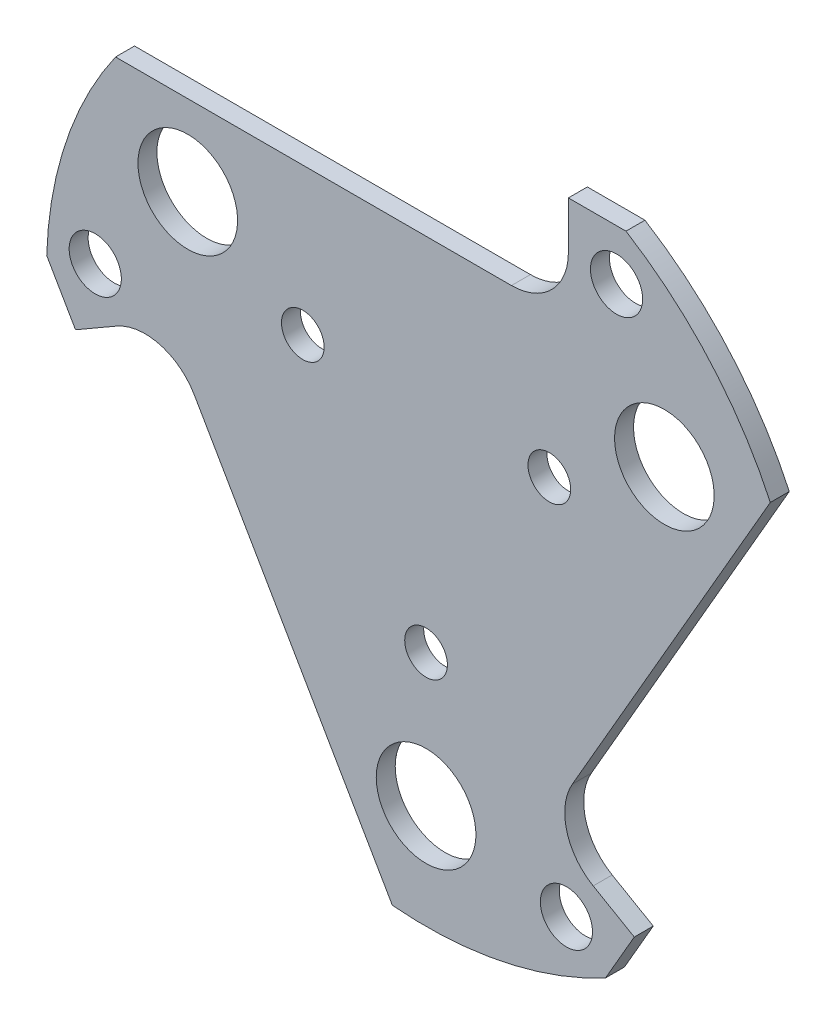
ISO-10303-21;
HEADER;
FILE_DESCRIPTION(('STEP AP214'),'2;1');
FILE_NAME('part.step','',(''),(''),'','','');
FILE_SCHEMA(('AUTOMOTIVE_DESIGN { 1 0 10303 214 1 1 1 1 }'));
ENDSEC;
DATA;
#1=APPLICATION_CONTEXT('core data for automotive mechanical design processes');
#2=APPLICATION_PROTOCOL_DEFINITION('international standard','automotive_design',2000,#1);
#3=PRODUCT_CONTEXT('',#1,'mechanical');
#4=PRODUCT('Part','Part','',(#3));
#5=PRODUCT_RELATED_PRODUCT_CATEGORY('part','',(#4));
#6=PRODUCT_DEFINITION_FORMATION('','',#4);
#7=PRODUCT_DEFINITION_CONTEXT('part definition',#1,'design');
#8=PRODUCT_DEFINITION('design','',#6,#7);
#9=PRODUCT_DEFINITION_SHAPE('','',#8);
#10=(LENGTH_UNIT() NAMED_UNIT(*) SI_UNIT(.MILLI.,.METRE.));
#11=(NAMED_UNIT(*) PLANE_ANGLE_UNIT() SI_UNIT($,.RADIAN.));
#12=(NAMED_UNIT(*) SI_UNIT($,.STERADIAN.) SOLID_ANGLE_UNIT());
#13=UNCERTAINTY_MEASURE_WITH_UNIT(LENGTH_MEASURE(1.E-05),#10,'distance_accuracy_value','');
#14=(GEOMETRIC_REPRESENTATION_CONTEXT(3) GLOBAL_UNCERTAINTY_ASSIGNED_CONTEXT((#13)) GLOBAL_UNIT_ASSIGNED_CONTEXT((#10,
#11,#12)) REPRESENTATION_CONTEXT('',''));
#15=CARTESIAN_POINT('',(0.,0.,0.));
#16=DIRECTION('',(0.,0.,1.));
#17=DIRECTION('',(1.,0.,0.));
#18=AXIS2_PLACEMENT_3D('',#15,#16,#17);
#19=CARTESIAN_POINT('',(2312.96914244149,1034.76844632745,0.));
#20=DIRECTION('',(0.,0.,1.));
#21=DIRECTION('',(1.,0.,0.));
#22=AXIS2_PLACEMENT_3D('',#19,#20,#21);
#23=PLANE('',#22);
#24=CARTESIAN_POINT('',(2312.96914244134,1019.76844632751,0.));
#25=DIRECTION('',(0.,0.,-1.));
#26=DIRECTION('',(-1.,0.,0.));
#27=AXIS2_PLACEMENT_3D('',#24,#25,#26);
#28=CIRCLE('',#27,2.24999999999964);
#29=CARTESIAN_POINT('',(2310.71914244134,1019.76844632751,0.));
#30=VERTEX_POINT('',#29);
#31=EDGE_CURVE('E235',#30,#30,#28,.F.);
#32=ORIENTED_EDGE('',*,*,#31,.T.);
#33=EDGE_LOOP('',(#32));
#34=FACE_BOUND('',#33,.T.);
#35=CARTESIAN_POINT('',(2325.95952349812,1042.26844632751,0.));
#36=DIRECTION('',(0.,0.,-1.));
#37=DIRECTION('',(-1.,0.,0.));
#38=AXIS2_PLACEMENT_3D('',#35,#36,#37);
#39=CIRCLE('',#38,2.25000000000008);
#40=CARTESIAN_POINT('',(2323.70952349812,1042.26844632751,0.));
#41=VERTEX_POINT('',#40);
#42=EDGE_CURVE('E238',#41,#41,#39,.F.);
#43=ORIENTED_EDGE('',*,*,#42,.T.);
#44=EDGE_LOOP('',(#43));
#45=FACE_BOUND('',#44,.T.);
#46=CARTESIAN_POINT('',(2333.04431771363,1063.43876787762,0.));
#47=DIRECTION('',(0.,0.,-1.));
#48=DIRECTION('',(-1.,0.,0.));
#49=AXIS2_PLACEMENT_3D('',#46,#47,#48);
#50=CIRCLE('',#49,2.75000000000025);
#51=CARTESIAN_POINT('',(2330.29431771363,1063.43876787762,0.));
#52=VERTEX_POINT('',#51);
#53=EDGE_CURVE('E241',#52,#52,#50,.F.);
#54=ORIENTED_EDGE('',*,*,#53,.T.);
#55=EDGE_LOOP('',(#54));
#56=FACE_BOUND('',#55,.T.);
#57=CARTESIAN_POINT('',(2312.96914244134,1005.76844632751,0.));
#58=DIRECTION('',(0.,0.,-1.));
#59=DIRECTION('',(-1.,0.,0.));
#60=AXIS2_PLACEMENT_3D('',#57,#58,#59);
#61=CIRCLE('',#60,5.24999999999976);
#62=CARTESIAN_POINT('',(2307.71914244134,1005.76844632751,0.));
#63=VERTEX_POINT('',#62);
#64=EDGE_CURVE('E137',#63,#63,#61,.F.);
#65=ORIENTED_EDGE('',*,*,#64,.T.);
#66=EDGE_LOOP('',(#65));
#67=FACE_BOUND('',#66,.T.);
#68=CARTESIAN_POINT('',(2287.8544057316,1049.26844632751,0.));
#69=DIRECTION('',(0.,0.,-1.));
#70=DIRECTION('',(-1.,0.,0.));
#71=AXIS2_PLACEMENT_3D('',#68,#69,#70);
#72=CIRCLE('',#71,5.2500000000002);
#73=CARTESIAN_POINT('',(2282.6044057316,1049.26844632751,0.));
#74=VERTEX_POINT('',#73);
#75=EDGE_CURVE('E134',#74,#74,#72,.F.);
#76=ORIENTED_EDGE('',*,*,#75,.T.);
#77=EDGE_LOOP('',(#76));
#78=FACE_BOUND('',#77,.T.);
#79=DIRECTION('',(1.,-1.3835835842717E-13,0.));
#80=VECTOR('',#79,1.);
#81=CARTESIAN_POINT('',(2321.96914244135,1057.76844632751,0.));
#82=LINE('',#81,#80);
#83=CARTESIAN_POINT('',(2280.24300609745,1057.76844632752,0.));
#84=VERTEX_POINT('',#83);
#85=CARTESIAN_POINT('',(2321.96914244137,1057.76844632751,0.));
#86=VERTEX_POINT('',#85);
#87=EDGE_CURVE('E116',#84,#86,#82,.T.);
#88=ORIENTED_EDGE('',*,*,#87,.T.);
#89=CARTESIAN_POINT('',(2321.96914244139,1063.76844632746,0.));
#90=DIRECTION('',(0.,0.,-1.));
#91=DIRECTION('',(-1.,0.,0.));
#92=AXIS2_PLACEMENT_3D('',#89,#90,#91);
#93=CIRCLE('',#92,5.99999999996159);
#94=CARTESIAN_POINT('',(2327.96914244134,1063.76844632748,0.));
#95=VERTEX_POINT('',#94);
#96=EDGE_CURVE('E246',#86,#95,#93,.F.);
#97=ORIENTED_EDGE('',*,*,#96,.T.);
#98=DIRECTION('',(0.,1.,0.));
#99=VECTOR('',#98,1.);
#100=CARTESIAN_POINT('',(2327.96914244134,1068.76844632751,0.));
#101=LINE('',#100,#99);
#102=CARTESIAN_POINT('',(2327.96914244134,1068.76844632751,0.));
#103=VERTEX_POINT('',#102);
#104=EDGE_CURVE('E142',#95,#103,#101,.T.);
#105=ORIENTED_EDGE('',*,*,#104,.T.);
#106=DIRECTION('',(1.,6.21737291379528E-13,0.));
#107=VECTOR('',#106,1.);
#108=CARTESIAN_POINT('',(2334.04044994704,1068.76844632751,0.));
#109=LINE('',#108,#107);
#110=CARTESIAN_POINT('',(2334.04044994704,1068.76844632751,0.));
#111=VERTEX_POINT('',#110);
#112=EDGE_CURVE('E149',#103,#111,#109,.T.);
#113=ORIENTED_EDGE('',*,*,#112,.T.);
#114=CARTESIAN_POINT('',(2312.96914244134,1034.76844632749,0.));
#115=DIRECTION('',(0.,0.,-1.));
#116=DIRECTION('',(-1.,0.,0.));
#117=AXIS2_PLACEMENT_3D('',#114,#115,#116);
#118=CIRCLE('',#117,40.0000000000187);
#119=CARTESIAN_POINT('',(2349.25079490035,1051.61011176905,0.));
#120=VERTEX_POINT('',#119);
#121=EDGE_CURVE('E158',#120,#111,#118,.F.);
#122=ORIENTED_EDGE('',*,*,#121,.F.);
#123=DIRECTION('',(-0.500000000000067,-0.8660254037844,0.));
#124=VECTOR('',#123,1.);
#125=CARTESIAN_POINT('',(2328.38772672838,1015.47421769345,0.));
#126=LINE('',#125,#124);
#127=CARTESIAN_POINT('',(2328.3877267284,1015.47421769348,0.));
#128=VERTEX_POINT('',#127);
#129=EDGE_CURVE('E155',#120,#128,#126,.T.);
#130=ORIENTED_EDGE('',*,*,#129,.T.);
#131=CARTESIAN_POINT('',(2333.58387915119,1012.47421769346,0.));
#132=DIRECTION('',(0.,0.,-1.));
#133=DIRECTION('',(-1.,0.,0.));
#134=AXIS2_PLACEMENT_3D('',#131,#132,#133);
#135=CIRCLE('',#134,6.00000000005795);
#136=CARTESIAN_POINT('',(2330.58387915113,1007.27806527072,0.));
#137=VERTEX_POINT('',#136);
#138=EDGE_CURVE('E250',#128,#137,#135,.F.);
#139=ORIENTED_EDGE('',*,*,#138,.T.);
#140=DIRECTION('',(0.866025403784535,-0.499999999999833,0.));
#141=VECTOR('',#140,1.);
#142=CARTESIAN_POINT('',(2334.91400617002,1004.77806527074,0.));
#143=LINE('',#142,#141);
#144=CARTESIAN_POINT('',(2334.91400617002,1004.77806527074,0.));
#145=VERTEX_POINT('',#144);
#146=EDGE_CURVE('E160',#137,#145,#143,.T.);
#147=ORIENTED_EDGE('',*,*,#146,.T.);
#148=DIRECTION('',(-0.500000000000088,-0.866025403784388,0.));
#149=VECTOR('',#148,1.);
#150=CARTESIAN_POINT('',(2331.87835241717,999.520158736614,0.));
#151=LINE('',#150,#149);
#152=CARTESIAN_POINT('',(2331.87835241717,999.520158736618,0.));
#153=VERTEX_POINT('',#152);
#154=EDGE_CURVE('E167',#145,#153,#151,.T.);
#155=ORIENTED_EDGE('',*,*,#154,.T.);
#156=CARTESIAN_POINT('',(2312.9691424413,1034.76844632772,0.));
#157=DIRECTION('',(0.,0.,-1.));
#158=DIRECTION('',(-1.,0.,0.));
#159=AXIS2_PLACEMENT_3D('',#156,#157,#158);
#160=CIRCLE('',#159,40.0000000002061);
#161=CARTESIAN_POINT('',(2309.41362632626,994.926780885972,0.));
#162=VERTEX_POINT('',#161);
#163=EDGE_CURVE('E176',#162,#153,#160,.F.);
#164=ORIENTED_EDGE('',*,*,#163,.F.);
#165=DIRECTION('',(-0.500000000000052,0.866025403784409,0.));
#166=VECTOR('',#165,1.);
#167=CARTESIAN_POINT('',(2288.5505581543,1031.06267496157,0.));
#168=LINE('',#167,#166);
#169=CARTESIAN_POINT('',(2288.5505581543,1031.06267496156,0.));
#170=VERTEX_POINT('',#169);
#171=EDGE_CURVE('E173',#162,#170,#168,.T.);
#172=ORIENTED_EDGE('',*,*,#171,.T.);
#173=CARTESIAN_POINT('',(2283.35440573158,1028.06267496153,0.));
#174=DIRECTION('',(0.,0.,-1.));
#175=DIRECTION('',(-1.,0.,0.));
#176=AXIS2_PLACEMENT_3D('',#173,#174,#175);
#177=CIRCLE('',#176,6.00000000003043);
#178=CARTESIAN_POINT('',(2280.35440573158,1033.25882738427,0.));
#179=VERTEX_POINT('',#178);
#180=EDGE_CURVE('E255',#170,#179,#177,.F.);
#181=ORIENTED_EDGE('',*,*,#180,.T.);
#182=DIRECTION('',(-0.866025403784356,-0.500000000000143,0.));
#183=VECTOR('',#182,1.);
#184=CARTESIAN_POINT('',(2276.02427871268,1030.75882738427,0.));
#185=LINE('',#184,#183);
#186=CARTESIAN_POINT('',(2276.02427871268,1030.75882738427,0.));
#187=VERTEX_POINT('',#186);
#188=EDGE_CURVE('E178',#179,#187,#185,.T.);
#189=ORIENTED_EDGE('',*,*,#188,.T.);
#190=DIRECTION('',(-0.499999999999916,0.866025403784487,0.));
#191=VECTOR('',#190,1.);
#192=CARTESIAN_POINT('',(2272.98862495983,1036.0167339184,0.));
#193=LINE('',#192,#191);
#194=CARTESIAN_POINT('',(2272.98862495982,1036.01673391841,0.));
#195=VERTEX_POINT('',#194);
#196=EDGE_CURVE('E119',#187,#195,#193,.T.);
#197=ORIENTED_EDGE('',*,*,#196,.T.);
#198=CARTESIAN_POINT('',(2312.96914244149,1034.76844632745,0.));
#199=DIRECTION('',(0.,0.,-1.));
#200=DIRECTION('',(-1.,0.,0.));
#201=AXIS2_PLACEMENT_3D('',#198,#199,#200);
#202=CIRCLE('',#201,40.0000000001489);
#203=EDGE_CURVE('E111',#84,#195,#202,.F.);
#204=ORIENTED_EDGE('',*,*,#203,.F.);
#205=EDGE_LOOP('',(#88,#97,#105,#113,#122,#130,#139,#147,#155,#164,#172,#181,#189,#197,#204));
#206=FACE_BOUND('',#205,.T.);
#207=CARTESIAN_POINT('',(2338.0838791511,1049.26844632751,0.));
#208=DIRECTION('',(0.,0.,-1.));
#209=DIRECTION('',(-1.,0.,0.));
#210=AXIS2_PLACEMENT_3D('',#207,#208,#209);
#211=CIRCLE('',#210,5.24999999999976);
#212=CARTESIAN_POINT('',(2332.8338791511,1049.26844632751,0.));
#213=VERTEX_POINT('',#212);
#214=EDGE_CURVE('E123',#213,#213,#211,.F.);
#215=ORIENTED_EDGE('',*,*,#214,.T.);
#216=EDGE_LOOP('',(#215));
#217=FACE_BOUND('',#216,.T.);
#218=CARTESIAN_POINT('',(2327.76078160227,1003.04767378122,0.));
#219=DIRECTION('',(0.,0.,-1.));
#220=DIRECTION('',(-1.,0.,0.));
#221=AXIS2_PLACEMENT_3D('',#218,#219,#220);
#222=CIRCLE('',#221,2.75000000000025);
#223=CARTESIAN_POINT('',(2325.01078160227,1003.04767378122,0.));
#224=VERTEX_POINT('',#223);
#225=EDGE_CURVE('E260',#224,#224,#222,.F.);
#226=ORIENTED_EDGE('',*,*,#225,.T.);
#227=EDGE_LOOP('',(#226));
#228=FACE_BOUND('',#227,.T.);
#229=CARTESIAN_POINT('',(2278.10232800813,1037.81889732368,0.));
#230=DIRECTION('',(0.,0.,-1.));
#231=DIRECTION('',(-1.,0.,0.));
#232=AXIS2_PLACEMENT_3D('',#229,#230,#231);
#233=CIRCLE('',#232,2.74999999999981);
#234=CARTESIAN_POINT('',(2275.35232800813,1037.81889732368,0.));
#235=VERTEX_POINT('',#234);
#236=EDGE_CURVE('E262',#235,#235,#233,.F.);
#237=ORIENTED_EDGE('',*,*,#236,.T.);
#238=EDGE_LOOP('',(#237));
#239=FACE_BOUND('',#238,.T.);
#240=CARTESIAN_POINT('',(2299.97876138458,1042.26844632751,0.));
#241=DIRECTION('',(0.,0.,-1.));
#242=DIRECTION('',(-1.,0.,0.));
#243=AXIS2_PLACEMENT_3D('',#240,#241,#242);
#244=CIRCLE('',#243,2.25000000000008);
#245=CARTESIAN_POINT('',(2297.72876138458,1042.26844632751,0.));
#246=VERTEX_POINT('',#245);
#247=EDGE_CURVE('E20',#246,#246,#244,.F.);
#248=ORIENTED_EDGE('',*,*,#247,.T.);
#249=EDGE_LOOP('',(#248));
#250=FACE_BOUND('',#249,.T.);
#251=ADVANCED_FACE('F17',(#34,#45,#56,#67,#78,#206,#217,#228,#239,#250),#23,.F.);
#252=CARTESIAN_POINT('',(2299.97876138458,1042.26844632751,2.));
#253=DIRECTION('',(0.,0.,-1.));
#254=DIRECTION('',(-1.,0.,0.));
#255=AXIS2_PLACEMENT_3D('',#252,#253,#254);
#256=CYLINDRICAL_SURFACE('',#255,2.25000000000008);
#257=ORIENTED_EDGE('',*,*,#247,.F.);
#258=EDGE_LOOP('',(#257));
#259=FACE_BOUND('',#258,.T.);
#260=CARTESIAN_POINT('',(2299.97876138458,1042.26844632751,2.));
#261=DIRECTION('',(0.,0.,-1.));
#262=DIRECTION('',(-1.,0.,0.));
#263=AXIS2_PLACEMENT_3D('',#260,#261,#262);
#264=CIRCLE('',#263,2.25000000000008);
#265=CARTESIAN_POINT('',(2297.72876138458,1042.26844632751,2.));
#266=VERTEX_POINT('',#265);
#267=EDGE_CURVE('E232',#266,#266,#264,.T.);
#268=ORIENTED_EDGE('',*,*,#267,.F.);
#269=EDGE_LOOP('',(#268));
#270=FACE_BOUND('',#269,.T.);
#271=ADVANCED_FACE('F270',(#259,#270),#256,.F.);
#272=CARTESIAN_POINT('',(2278.10232800813,1037.81889732368,2.));
#273=DIRECTION('',(0.,0.,-1.));
#274=DIRECTION('',(-1.,0.,0.));
#275=AXIS2_PLACEMENT_3D('',#272,#273,#274);
#276=CYLINDRICAL_SURFACE('',#275,2.74999999999981);
#277=ORIENTED_EDGE('',*,*,#236,.F.);
#278=EDGE_LOOP('',(#277));
#279=FACE_BOUND('',#278,.T.);
#280=CARTESIAN_POINT('',(2278.10232800813,1037.81889732368,2.));
#281=DIRECTION('',(0.,0.,-1.));
#282=DIRECTION('',(-1.,0.,0.));
#283=AXIS2_PLACEMENT_3D('',#280,#281,#282);
#284=CIRCLE('',#283,2.74999999999981);
#285=CARTESIAN_POINT('',(2275.35232800813,1037.81889732368,2.));
#286=VERTEX_POINT('',#285);
#287=EDGE_CURVE('E229',#286,#286,#284,.T.);
#288=ORIENTED_EDGE('',*,*,#287,.F.);
#289=EDGE_LOOP('',(#288));
#290=FACE_BOUND('',#289,.T.);
#291=ADVANCED_FACE('F273',(#279,#290),#276,.F.);
#292=CARTESIAN_POINT('',(2327.76078160227,1003.04767378122,2.));
#293=DIRECTION('',(0.,0.,-1.));
#294=DIRECTION('',(-1.,0.,0.));
#295=AXIS2_PLACEMENT_3D('',#292,#293,#294);
#296=CYLINDRICAL_SURFACE('',#295,2.75000000000025);
#297=ORIENTED_EDGE('',*,*,#225,.F.);
#298=EDGE_LOOP('',(#297));
#299=FACE_BOUND('',#298,.T.);
#300=CARTESIAN_POINT('',(2327.76078160227,1003.04767378122,2.));
#301=DIRECTION('',(0.,0.,-1.));
#302=DIRECTION('',(-1.,0.,0.));
#303=AXIS2_PLACEMENT_3D('',#300,#301,#302);
#304=CIRCLE('',#303,2.75000000000025);
#305=CARTESIAN_POINT('',(2325.01078160227,1003.04767378122,2.));
#306=VERTEX_POINT('',#305);
#307=EDGE_CURVE('E226',#306,#306,#304,.T.);
#308=ORIENTED_EDGE('',*,*,#307,.F.);
#309=EDGE_LOOP('',(#308));
#310=FACE_BOUND('',#309,.T.);
#311=ADVANCED_FACE('F364',(#299,#310),#296,.F.);
#312=CARTESIAN_POINT('',(2338.0838791511,1049.26844632751,2.));
#313=DIRECTION('',(0.,0.,-1.));
#314=DIRECTION('',(-1.,0.,0.));
#315=AXIS2_PLACEMENT_3D('',#312,#313,#314);
#316=CYLINDRICAL_SURFACE('',#315,5.24999999999976);
#317=ORIENTED_EDGE('',*,*,#214,.F.);
#318=EDGE_LOOP('',(#317));
#319=FACE_BOUND('',#318,.T.);
#320=CARTESIAN_POINT('',(2338.0838791511,1049.26844632751,2.));
#321=DIRECTION('',(0.,0.,-1.));
#322=DIRECTION('',(-1.,0.,0.));
#323=AXIS2_PLACEMENT_3D('',#320,#321,#322);
#324=CIRCLE('',#323,5.24999999999976);
#325=CARTESIAN_POINT('',(2332.8338791511,1049.26844632751,2.));
#326=VERTEX_POINT('',#325);
#327=EDGE_CURVE('E223',#326,#326,#324,.T.);
#328=ORIENTED_EDGE('',*,*,#327,.F.);
#329=EDGE_LOOP('',(#328));
#330=FACE_BOUND('',#329,.T.);
#331=ADVANCED_FACE('F361',(#319,#330),#316,.F.);
#332=CARTESIAN_POINT('',(2312.96914244149,1034.76844632745,2.));
#333=DIRECTION('',(0.,0.,-1.));
#334=DIRECTION('',(-1.,0.,0.));
#335=AXIS2_PLACEMENT_3D('',#332,#333,#334);
#336=CYLINDRICAL_SURFACE('',#335,40.0000000001489);
#337=CARTESIAN_POINT('',(2312.96914244149,1034.76844632745,2.));
#338=DIRECTION('',(0.,0.,-1.));
#339=DIRECTION('',(-1.,0.,0.));
#340=AXIS2_PLACEMENT_3D('',#337,#338,#339);
#341=CIRCLE('',#340,40.0000000001489);
#342=CARTESIAN_POINT('',(2280.24300609744,1057.76844632751,2.));
#343=VERTEX_POINT('',#342);
#344=CARTESIAN_POINT('',(2272.98862495982,1036.01673391841,2.));
#345=VERTEX_POINT('',#344);
#346=EDGE_CURVE('E129',#343,#345,#341,.F.);
#347=ORIENTED_EDGE('',*,*,#346,.F.);
#348=DIRECTION('',(0.,0.,1.));
#349=VECTOR('',#348,1.);
#350=CARTESIAN_POINT('',(2280.24300609744,1057.76844632752,2.));
#351=LINE('',#350,#349);
#352=EDGE_CURVE('E126',#343,#84,#351,.F.);
#353=ORIENTED_EDGE('',*,*,#352,.T.);
#354=ORIENTED_EDGE('',*,*,#203,.T.);
#355=DIRECTION('',(0.,0.,1.));
#356=VECTOR('',#355,1.);
#357=CARTESIAN_POINT('',(2272.98862495983,1036.0167339184,2.));
#358=LINE('',#357,#356);
#359=EDGE_CURVE('E122',#195,#345,#358,.T.);
#360=ORIENTED_EDGE('',*,*,#359,.T.);
#361=EDGE_LOOP('',(#347,#353,#354,#360));
#362=FACE_BOUND('',#361,.T.);
#363=ADVANCED_FACE('F127',(#362),#336,.T.);
#364=CARTESIAN_POINT('',(2272.98862495983,1036.0167339184,2.));
#365=DIRECTION('',(0.866025403784487,0.499999999999916,0.));
#366=DIRECTION('',(-0.499999999999916,0.866025403784487,0.));
#367=AXIS2_PLACEMENT_3D('',#364,#365,#366);
#368=PLANE('',#367);
#369=DIRECTION('',(0.,0.,1.));
#370=VECTOR('',#369,1.);
#371=CARTESIAN_POINT('',(2276.02427871268,1030.75882738427,2.));
#372=LINE('',#371,#370);
#373=CARTESIAN_POINT('',(2276.02427871268,1030.75882738427,2.));
#374=VERTEX_POINT('',#373);
#375=EDGE_CURVE('E181',#187,#374,#372,.T.);
#376=ORIENTED_EDGE('',*,*,#375,.T.);
#377=DIRECTION('',(0.499999999999545,-0.866025403784701,0.));
#378=VECTOR('',#377,1.);
#379=CARTESIAN_POINT('',(2272.98862495983,1036.0167339184,2.));
#380=LINE('',#379,#378);
#381=EDGE_CURVE('E222',#345,#374,#380,.T.);
#382=ORIENTED_EDGE('',*,*,#381,.F.);
#383=ORIENTED_EDGE('',*,*,#359,.F.);
#384=ORIENTED_EDGE('',*,*,#196,.F.);
#385=EDGE_LOOP('',(#376,#382,#383,#384));
#386=FACE_BOUND('',#385,.T.);
#387=ADVANCED_FACE('F354',(#386),#368,.F.);
#388=CARTESIAN_POINT('',(2276.02427871268,1030.75882738427,2.));
#389=DIRECTION('',(-0.500000000000143,0.866025403784356,0.));
#390=DIRECTION('',(-0.866025403784356,-0.500000000000143,0.));
#391=AXIS2_PLACEMENT_3D('',#388,#389,#390);
#392=PLANE('',#391);
#393=DIRECTION('',(0.,0.,-1.));
#394=VECTOR('',#393,1.);
#395=CARTESIAN_POINT('',(2280.35440573159,1033.25882738428,2.));
#396=LINE('',#395,#394);
#397=CARTESIAN_POINT('',(2280.35440573158,1033.25882738427,2.));
#398=VERTEX_POINT('',#397);
#399=EDGE_CURVE('E180',#179,#398,#396,.F.);
#400=ORIENTED_EDGE('',*,*,#399,.T.);
#401=DIRECTION('',(0.866025403784322,0.500000000000202,0.));
#402=VECTOR('',#401,1.);
#403=CARTESIAN_POINT('',(2276.02427871268,1030.75882738427,2.));
#404=LINE('',#403,#402);
#405=EDGE_CURVE('E220',#374,#398,#404,.T.);
#406=ORIENTED_EDGE('',*,*,#405,.F.);
#407=ORIENTED_EDGE('',*,*,#375,.F.);
#408=ORIENTED_EDGE('',*,*,#188,.F.);
#409=EDGE_LOOP('',(#400,#406,#407,#408));
#410=FACE_BOUND('',#409,.T.);
#411=ADVANCED_FACE('F350',(#410),#392,.F.);
#412=CARTESIAN_POINT('',(2283.35440573158,1028.06267496153,2.));
#413=DIRECTION('',(0.,0.,-1.));
#414=DIRECTION('',(-1.,0.,0.));
#415=AXIS2_PLACEMENT_3D('',#412,#413,#414);
#416=CYLINDRICAL_SURFACE('',#415,6.00000000003043);
#417=DIRECTION('',(0.,0.,1.));
#418=VECTOR('',#417,1.);
#419=CARTESIAN_POINT('',(2288.5505581543,1031.06267496157,2.));
#420=LINE('',#419,#418);
#421=CARTESIAN_POINT('',(2288.5505581543,1031.06267496156,2.));
#422=VERTEX_POINT('',#421);
#423=EDGE_CURVE('E177',#170,#422,#420,.T.);
#424=ORIENTED_EDGE('',*,*,#423,.T.);
#425=CARTESIAN_POINT('',(2283.35440573158,1028.06267496153,2.));
#426=DIRECTION('',(0.,0.,-1.));
#427=DIRECTION('',(-1.,0.,0.));
#428=AXIS2_PLACEMENT_3D('',#425,#426,#427);
#429=CIRCLE('',#428,6.00000000003043);
#430=EDGE_CURVE('E217',#398,#422,#429,.T.);
#431=ORIENTED_EDGE('',*,*,#430,.F.);
#432=ORIENTED_EDGE('',*,*,#399,.F.);
#433=ORIENTED_EDGE('',*,*,#180,.F.);
#434=EDGE_LOOP('',(#424,#431,#432,#433));
#435=FACE_BOUND('',#434,.T.);
#436=ADVANCED_FACE('F346',(#435),#416,.F.);
#437=CARTESIAN_POINT('',(2288.5505581543,1031.06267496157,2.));
#438=DIRECTION('',(0.866025403784409,0.500000000000052,0.));
#439=DIRECTION('',(-0.500000000000052,0.866025403784409,0.));
#440=AXIS2_PLACEMENT_3D('',#437,#438,#439);
#441=PLANE('',#440);
#442=DIRECTION('',(0.,0.,-1.));
#443=VECTOR('',#442,1.);
#444=CARTESIAN_POINT('',(2309.41362632626,994.926780885972,2.));
#445=LINE('',#444,#443);
#446=CARTESIAN_POINT('',(2309.41362632626,994.926780885972,2.));
#447=VERTEX_POINT('',#446);
#448=EDGE_CURVE('E254',#447,#162,#445,.T.);
#449=ORIENTED_EDGE('',*,*,#448,.F.);
#450=DIRECTION('',(0.500000000000092,-0.866025403784386,0.));
#451=VECTOR('',#450,1.);
#452=CARTESIAN_POINT('',(2288.5505581543,1031.06267496157,2.));
#453=LINE('',#452,#451);
#454=EDGE_CURVE('E216',#422,#447,#453,.T.);
#455=ORIENTED_EDGE('',*,*,#454,.F.);
#456=ORIENTED_EDGE('',*,*,#423,.F.);
#457=ORIENTED_EDGE('',*,*,#171,.F.);
#458=EDGE_LOOP('',(#449,#455,#456,#457));
#459=FACE_BOUND('',#458,.T.);
#460=ADVANCED_FACE('F342',(#459),#441,.F.);
#461=CARTESIAN_POINT('',(2312.9691424413,1034.76844632772,2.));
#462=DIRECTION('',(0.,0.,-1.));
#463=DIRECTION('',(-1.,0.,0.));
#464=AXIS2_PLACEMENT_3D('',#461,#462,#463);
#465=CYLINDRICAL_SURFACE('',#464,40.0000000002061);
#466=CARTESIAN_POINT('',(2312.9691424413,1034.76844632772,2.));
#467=DIRECTION('',(0.,0.,-1.));
#468=DIRECTION('',(-1.,0.,0.));
#469=AXIS2_PLACEMENT_3D('',#466,#467,#468);
#470=CIRCLE('',#469,40.0000000002061);
#471=CARTESIAN_POINT('',(2331.87835241717,999.520158736618,2.));
#472=VERTEX_POINT('',#471);
#473=EDGE_CURVE('E212',#447,#472,#470,.F.);
#474=ORIENTED_EDGE('',*,*,#473,.F.);
#475=ORIENTED_EDGE('',*,*,#448,.T.);
#476=ORIENTED_EDGE('',*,*,#163,.T.);
#477=DIRECTION('',(0.,0.,1.));
#478=VECTOR('',#477,1.);
#479=CARTESIAN_POINT('',(2331.87835241717,999.520158736614,2.));
#480=LINE('',#479,#478);
#481=EDGE_CURVE('E170',#153,#472,#480,.T.);
#482=ORIENTED_EDGE('',*,*,#481,.T.);
#483=EDGE_LOOP('',(#474,#475,#476,#482));
#484=FACE_BOUND('',#483,.T.);
#485=ADVANCED_FACE('F338',(#484),#465,.T.);
#486=CARTESIAN_POINT('',(2331.87835241717,999.520158736614,2.));
#487=DIRECTION('',(-0.866025403784388,0.500000000000088,0.));
#488=DIRECTION('',(-0.500000000000088,-0.866025403784388,0.));
#489=AXIS2_PLACEMENT_3D('',#486,#487,#488);
#490=PLANE('',#489);
#491=DIRECTION('',(0.,0.,1.));
#492=VECTOR('',#491,1.);
#493=CARTESIAN_POINT('',(2334.91400617002,1004.77806527074,2.));
#494=LINE('',#493,#492);
#495=CARTESIAN_POINT('',(2334.91400617002,1004.77806527074,2.));
#496=VERTEX_POINT('',#495);
#497=EDGE_CURVE('E164',#145,#496,#494,.T.);
#498=ORIENTED_EDGE('',*,*,#497,.T.);
#499=DIRECTION('',(0.499999999999831,0.866025403784537,0.));
#500=VECTOR('',#499,1.);
#501=CARTESIAN_POINT('',(2331.87835241717,999.520158736614,2.));
#502=LINE('',#501,#500);
#503=EDGE_CURVE('E215',#472,#496,#502,.T.);
#504=ORIENTED_EDGE('',*,*,#503,.F.);
#505=ORIENTED_EDGE('',*,*,#481,.F.);
#506=ORIENTED_EDGE('',*,*,#154,.F.);
#507=EDGE_LOOP('',(#498,#504,#505,#506));
#508=FACE_BOUND('',#507,.T.);
#509=ADVANCED_FACE('F334',(#508),#490,.F.);
#510=CARTESIAN_POINT('',(2334.91400617002,1004.77806527074,2.));
#511=DIRECTION('',(-0.499999999999833,-0.866025403784535,0.));
#512=DIRECTION('',(0.866025403784535,-0.499999999999833,0.));
#513=AXIS2_PLACEMENT_3D('',#510,#511,#512);
#514=PLANE('',#513);
#515=DIRECTION('',(0.,0.,-1.));
#516=VECTOR('',#515,1.);
#517=CARTESIAN_POINT('',(2330.58387915109,1007.27806527074,2.));
#518=LINE('',#517,#516);
#519=CARTESIAN_POINT('',(2330.58387915113,1007.27806527072,2.));
#520=VERTEX_POINT('',#519);
#521=EDGE_CURVE('E163',#137,#520,#518,.F.);
#522=ORIENTED_EDGE('',*,*,#521,.T.);
#523=DIRECTION('',(-0.866025403784833,0.499999999999317,0.));
#524=VECTOR('',#523,1.);
#525=CARTESIAN_POINT('',(2334.91400617002,1004.77806527074,2.));
#526=LINE('',#525,#524);
#527=EDGE_CURVE('E211',#496,#520,#526,.T.);
#528=ORIENTED_EDGE('',*,*,#527,.F.);
#529=ORIENTED_EDGE('',*,*,#497,.F.);
#530=ORIENTED_EDGE('',*,*,#146,.F.);
#531=EDGE_LOOP('',(#522,#528,#529,#530));
#532=FACE_BOUND('',#531,.T.);
#533=ADVANCED_FACE('F330',(#532),#514,.F.);
#534=CARTESIAN_POINT('',(2333.58387915119,1012.47421769346,2.));
#535=DIRECTION('',(0.,0.,-1.));
#536=DIRECTION('',(-1.,0.,0.));
#537=AXIS2_PLACEMENT_3D('',#534,#535,#536);
#538=CYLINDRICAL_SURFACE('',#537,6.00000000005795);
#539=DIRECTION('',(0.,0.,1.));
#540=VECTOR('',#539,1.);
#541=CARTESIAN_POINT('',(2328.38772672838,1015.47421769346,2.));
#542=LINE('',#541,#540);
#543=CARTESIAN_POINT('',(2328.38772672841,1015.47421769347,2.));
#544=VERTEX_POINT('',#543);
#545=EDGE_CURVE('E159',#128,#544,#542,.T.);
#546=ORIENTED_EDGE('',*,*,#545,.T.);
#547=CARTESIAN_POINT('',(2333.58387915119,1012.47421769346,2.));
#548=DIRECTION('',(0.,0.,-1.));
#549=DIRECTION('',(-1.,0.,0.));
#550=AXIS2_PLACEMENT_3D('',#547,#548,#549);
#551=CIRCLE('',#550,6.00000000005795);
#552=EDGE_CURVE('E208',#520,#544,#551,.T.);
#553=ORIENTED_EDGE('',*,*,#552,.F.);
#554=ORIENTED_EDGE('',*,*,#521,.F.);
#555=ORIENTED_EDGE('',*,*,#138,.F.);
#556=EDGE_LOOP('',(#546,#553,#554,#555));
#557=FACE_BOUND('',#556,.T.);
#558=ADVANCED_FACE('F326',(#557),#538,.F.);
#559=CARTESIAN_POINT('',(2328.38772672838,1015.47421769345,2.));
#560=DIRECTION('',(-0.8660254037844,0.500000000000067,0.));
#561=DIRECTION('',(-0.500000000000067,-0.8660254037844,0.));
#562=AXIS2_PLACEMENT_3D('',#559,#560,#561);
#563=PLANE('',#562);
#564=DIRECTION('',(0.,0.,-1.));
#565=VECTOR('',#564,1.);
#566=CARTESIAN_POINT('',(2349.25079490035,1051.61011176904,2.));
#567=LINE('',#566,#565);
#568=CARTESIAN_POINT('',(2349.25079490035,1051.61011176904,2.));
#569=VERTEX_POINT('',#568);
#570=EDGE_CURVE('E249',#569,#120,#567,.T.);
#571=ORIENTED_EDGE('',*,*,#570,.F.);
#572=DIRECTION('',(0.499999999999721,0.8660254037846,0.));
#573=VECTOR('',#572,1.);
#574=CARTESIAN_POINT('',(2328.38772672841,1015.47421769344,2.));
#575=LINE('',#574,#573);
#576=EDGE_CURVE('E207',#544,#569,#575,.T.);
#577=ORIENTED_EDGE('',*,*,#576,.F.);
#578=ORIENTED_EDGE('',*,*,#545,.F.);
#579=ORIENTED_EDGE('',*,*,#129,.F.);
#580=EDGE_LOOP('',(#571,#577,#578,#579));
#581=FACE_BOUND('',#580,.T.);
#582=ADVANCED_FACE('F322',(#581),#563,.F.);
#583=CARTESIAN_POINT('',(2312.96914244134,1034.76844632749,2.));
#584=DIRECTION('',(0.,0.,-1.));
#585=DIRECTION('',(-1.,0.,0.));
#586=AXIS2_PLACEMENT_3D('',#583,#584,#585);
#587=CYLINDRICAL_SURFACE('',#586,40.0000000000187);
#588=CARTESIAN_POINT('',(2312.96914244134,1034.76844632749,2.));
#589=DIRECTION('',(0.,0.,-1.));
#590=DIRECTION('',(-1.,0.,0.));
#591=AXIS2_PLACEMENT_3D('',#588,#589,#590);
#592=CIRCLE('',#591,40.0000000000187);
#593=CARTESIAN_POINT('',(2334.04044994704,1068.76844632751,2.));
#594=VERTEX_POINT('',#593);
#595=EDGE_CURVE('E203',#569,#594,#592,.F.);
#596=ORIENTED_EDGE('',*,*,#595,.F.);
#597=ORIENTED_EDGE('',*,*,#570,.T.);
#598=ORIENTED_EDGE('',*,*,#121,.T.);
#599=DIRECTION('',(0.,0.,1.));
#600=VECTOR('',#599,1.);
#601=CARTESIAN_POINT('',(2334.04044994704,1068.76844632751,2.));
#602=LINE('',#601,#600);
#603=EDGE_CURVE('E152',#111,#594,#602,.T.);
#604=ORIENTED_EDGE('',*,*,#603,.T.);
#605=EDGE_LOOP('',(#596,#597,#598,#604));
#606=FACE_BOUND('',#605,.T.);
#607=ADVANCED_FACE('F318',(#606),#587,.T.);
#608=CARTESIAN_POINT('',(2334.04044994704,1068.76844632751,2.));
#609=DIRECTION('',(6.21737291379528E-13,-1.,0.));
#610=DIRECTION('',(1.,6.21737291379528E-13,0.));
#611=AXIS2_PLACEMENT_3D('',#608,#609,#610);
#612=PLANE('',#611);
#613=DIRECTION('',(0.,0.,-1.));
#614=VECTOR('',#613,1.);
#615=CARTESIAN_POINT('',(2327.96914244134,1068.76844632751,2.));
#616=LINE('',#615,#614);
#617=CARTESIAN_POINT('',(2327.96914244134,1068.76844632751,2.));
#618=VERTEX_POINT('',#617);
#619=EDGE_CURVE('E146',#103,#618,#616,.F.);
#620=ORIENTED_EDGE('',*,*,#619,.T.);
#621=DIRECTION('',(1.,0.,0.));
#622=VECTOR('',#621,1.);
#623=CARTESIAN_POINT('',(2312.96914244149,1068.76844632751,2.));
#624=LINE('',#623,#622);
#625=EDGE_CURVE('E206',#594,#618,#624,.F.);
#626=ORIENTED_EDGE('',*,*,#625,.F.);
#627=ORIENTED_EDGE('',*,*,#603,.F.);
#628=ORIENTED_EDGE('',*,*,#112,.F.);
#629=EDGE_LOOP('',(#620,#626,#627,#628));
#630=FACE_BOUND('',#629,.T.);
#631=ADVANCED_FACE('F314',(#630),#612,.F.);
#632=CARTESIAN_POINT('',(2327.96914244134,1068.76844632751,2.));
#633=DIRECTION('',(1.,0.,0.));
#634=DIRECTION('',(0.,0.,-1.));
#635=AXIS2_PLACEMENT_3D('',#632,#633,#634);
#636=PLANE('',#635);
#637=DIRECTION('',(0.,0.,-1.));
#638=VECTOR('',#637,1.);
#639=CARTESIAN_POINT('',(2327.96914244135,1063.76844632751,2.));
#640=LINE('',#639,#638);
#641=CARTESIAN_POINT('',(2327.96914244134,1063.76844632748,2.));
#642=VERTEX_POINT('',#641);
#643=EDGE_CURVE('E145',#95,#642,#640,.F.);
#644=ORIENTED_EDGE('',*,*,#643,.T.);
#645=DIRECTION('',(0.,1.,0.));
#646=VECTOR('',#645,1.);
#647=CARTESIAN_POINT('',(2327.96914244134,1034.76844632745,2.));
#648=LINE('',#647,#646);
#649=EDGE_CURVE('E202',#618,#642,#648,.F.);
#650=ORIENTED_EDGE('',*,*,#649,.F.);
#651=ORIENTED_EDGE('',*,*,#619,.F.);
#652=ORIENTED_EDGE('',*,*,#104,.F.);
#653=EDGE_LOOP('',(#644,#650,#651,#652));
#654=FACE_BOUND('',#653,.T.);
#655=ADVANCED_FACE('F311',(#654),#636,.F.);
#656=CARTESIAN_POINT('',(2321.96914244139,1063.76844632746,2.));
#657=DIRECTION('',(0.,0.,-1.));
#658=DIRECTION('',(-1.,0.,0.));
#659=AXIS2_PLACEMENT_3D('',#656,#657,#658);
#660=CYLINDRICAL_SURFACE('',#659,5.99999999996159);
#661=DIRECTION('',(0.,0.,1.));
#662=VECTOR('',#661,1.);
#663=CARTESIAN_POINT('',(2321.96914244135,1057.76844632751,2.));
#664=LINE('',#663,#662);
#665=CARTESIAN_POINT('',(2321.96914244137,1057.7684463275,2.));
#666=VERTEX_POINT('',#665);
#667=EDGE_CURVE('E35',#86,#666,#664,.T.);
#668=ORIENTED_EDGE('',*,*,#667,.T.);
#669=CARTESIAN_POINT('',(2321.96914244139,1063.76844632746,2.));
#670=DIRECTION('',(0.,0.,-1.));
#671=DIRECTION('',(-1.,0.,0.));
#672=AXIS2_PLACEMENT_3D('',#669,#670,#671);
#673=CIRCLE('',#672,5.99999999996159);
#674=EDGE_CURVE('E199',#642,#666,#673,.T.);
#675=ORIENTED_EDGE('',*,*,#674,.F.);
#676=ORIENTED_EDGE('',*,*,#643,.F.);
#677=ORIENTED_EDGE('',*,*,#96,.F.);
#678=EDGE_LOOP('',(#668,#675,#676,#677));
#679=FACE_BOUND('',#678,.T.);
#680=ADVANCED_FACE('F308',(#679),#660,.F.);
#681=CARTESIAN_POINT('',(2321.96914244135,1057.76844632751,2.));
#682=DIRECTION('',(-1.3835835842717E-13,-1.,0.));
#683=DIRECTION('',(1.,-1.3835835842717E-13,0.));
#684=AXIS2_PLACEMENT_3D('',#681,#682,#683);
#685=PLANE('',#684);
#686=ORIENTED_EDGE('',*,*,#352,.F.);
#687=DIRECTION('',(1.,0.,0.));
#688=VECTOR('',#687,1.);
#689=CARTESIAN_POINT('',(2312.96914244149,1057.7684463275,2.));
#690=LINE('',#689,#688);
#691=EDGE_CURVE('E198',#666,#343,#690,.F.);
#692=ORIENTED_EDGE('',*,*,#691,.F.);
#693=ORIENTED_EDGE('',*,*,#667,.F.);
#694=ORIENTED_EDGE('',*,*,#87,.F.);
#695=EDGE_LOOP('',(#686,#692,#693,#694));
#696=FACE_BOUND('',#695,.T.);
#697=ADVANCED_FACE('F133',(#696),#685,.F.);
#698=CARTESIAN_POINT('',(2287.8544057316,1049.26844632751,2.));
#699=DIRECTION('',(0.,0.,-1.));
#700=DIRECTION('',(-1.,0.,0.));
#701=AXIS2_PLACEMENT_3D('',#698,#699,#700);
#702=CYLINDRICAL_SURFACE('',#701,5.2500000000002);
#703=ORIENTED_EDGE('',*,*,#75,.F.);
#704=EDGE_LOOP('',(#703));
#705=FACE_BOUND('',#704,.T.);
#706=CARTESIAN_POINT('',(2287.8544057316,1049.26844632751,2.));
#707=DIRECTION('',(0.,0.,-1.));
#708=DIRECTION('',(-1.,0.,0.));
#709=AXIS2_PLACEMENT_3D('',#706,#707,#708);
#710=CIRCLE('',#709,5.2500000000002);
#711=CARTESIAN_POINT('',(2282.6044057316,1049.26844632751,2.));
#712=VERTEX_POINT('',#711);
#713=EDGE_CURVE('E195',#712,#712,#710,.T.);
#714=ORIENTED_EDGE('',*,*,#713,.F.);
#715=EDGE_LOOP('',(#714));
#716=FACE_BOUND('',#715,.T.);
#717=ADVANCED_FACE('F301',(#705,#716),#702,.F.);
#718=CARTESIAN_POINT('',(2312.96914244134,1005.76844632751,2.));
#719=DIRECTION('',(0.,0.,-1.));
#720=DIRECTION('',(-1.,0.,0.));
#721=AXIS2_PLACEMENT_3D('',#718,#719,#720);
#722=CYLINDRICAL_SURFACE('',#721,5.24999999999976);
#723=ORIENTED_EDGE('',*,*,#64,.F.);
#724=EDGE_LOOP('',(#723));
#725=FACE_BOUND('',#724,.T.);
#726=CARTESIAN_POINT('',(2312.96914244134,1005.76844632751,2.));
#727=DIRECTION('',(0.,0.,-1.));
#728=DIRECTION('',(-1.,0.,0.));
#729=AXIS2_PLACEMENT_3D('',#726,#727,#728);
#730=CIRCLE('',#729,5.24999999999976);
#731=CARTESIAN_POINT('',(2307.71914244134,1005.76844632751,2.));
#732=VERTEX_POINT('',#731);
#733=EDGE_CURVE('E192',#732,#732,#730,.T.);
#734=ORIENTED_EDGE('',*,*,#733,.F.);
#735=EDGE_LOOP('',(#734));
#736=FACE_BOUND('',#735,.T.);
#737=ADVANCED_FACE('F297',(#725,#736),#722,.F.);
#738=CARTESIAN_POINT('',(2333.04431771363,1063.43876787762,2.));
#739=DIRECTION('',(0.,0.,-1.));
#740=DIRECTION('',(-1.,0.,0.));
#741=AXIS2_PLACEMENT_3D('',#738,#739,#740);
#742=CYLINDRICAL_SURFACE('',#741,2.75000000000025);
#743=ORIENTED_EDGE('',*,*,#53,.F.);
#744=EDGE_LOOP('',(#743));
#745=FACE_BOUND('',#744,.T.);
#746=CARTESIAN_POINT('',(2333.04431771363,1063.43876787762,2.));
#747=DIRECTION('',(0.,0.,-1.));
#748=DIRECTION('',(-1.,0.,0.));
#749=AXIS2_PLACEMENT_3D('',#746,#747,#748);
#750=CIRCLE('',#749,2.75000000000025);
#751=CARTESIAN_POINT('',(2330.29431771363,1063.43876787762,2.));
#752=VERTEX_POINT('',#751);
#753=EDGE_CURVE('E189',#752,#752,#750,.T.);
#754=ORIENTED_EDGE('',*,*,#753,.F.);
#755=EDGE_LOOP('',(#754));
#756=FACE_BOUND('',#755,.T.);
#757=ADVANCED_FACE('F293',(#745,#756),#742,.F.);
#758=CARTESIAN_POINT('',(2325.95952349812,1042.26844632751,2.));
#759=DIRECTION('',(0.,0.,-1.));
#760=DIRECTION('',(-1.,0.,0.));
#761=AXIS2_PLACEMENT_3D('',#758,#759,#760);
#762=CYLINDRICAL_SURFACE('',#761,2.25000000000008);
#763=ORIENTED_EDGE('',*,*,#42,.F.);
#764=EDGE_LOOP('',(#763));
#765=FACE_BOUND('',#764,.T.);
#766=CARTESIAN_POINT('',(2325.95952349812,1042.26844632751,2.));
#767=DIRECTION('',(0.,0.,-1.));
#768=DIRECTION('',(-1.,0.,0.));
#769=AXIS2_PLACEMENT_3D('',#766,#767,#768);
#770=CIRCLE('',#769,2.25000000000008);
#771=CARTESIAN_POINT('',(2323.70952349812,1042.26844632751,2.));
#772=VERTEX_POINT('',#771);
#773=EDGE_CURVE('E26',#772,#772,#770,.T.);
#774=ORIENTED_EDGE('',*,*,#773,.F.);
#775=EDGE_LOOP('',(#774));
#776=FACE_BOUND('',#775,.T.);
#777=ADVANCED_FACE('F286',(#765,#776),#762,.F.);
#778=CARTESIAN_POINT('',(2312.96914244134,1019.76844632751,2.));
#779=DIRECTION('',(0.,0.,-1.));
#780=DIRECTION('',(-1.,0.,0.));
#781=AXIS2_PLACEMENT_3D('',#778,#779,#780);
#782=CYLINDRICAL_SURFACE('',#781,2.24999999999964);
#783=ORIENTED_EDGE('',*,*,#31,.F.);
#784=EDGE_LOOP('',(#783));
#785=FACE_BOUND('',#784,.T.);
#786=CARTESIAN_POINT('',(2312.96914244134,1019.76844632751,2.));
#787=DIRECTION('',(0.,0.,-1.));
#788=DIRECTION('',(-1.,0.,0.));
#789=AXIS2_PLACEMENT_3D('',#786,#787,#788);
#790=CIRCLE('',#789,2.24999999999964);
#791=CARTESIAN_POINT('',(2310.71914244134,1019.76844632751,2.));
#792=VERTEX_POINT('',#791);
#793=EDGE_CURVE('E11',#792,#792,#790,.T.);
#794=ORIENTED_EDGE('',*,*,#793,.F.);
#795=EDGE_LOOP('',(#794));
#796=FACE_BOUND('',#795,.T.);
#797=ADVANCED_FACE('F278',(#785,#796),#782,.F.);
#798=CARTESIAN_POINT('',(2312.96914244149,1034.76844632745,2.));
#799=DIRECTION('',(0.,0.,1.));
#800=DIRECTION('',(1.,0.,0.));
#801=AXIS2_PLACEMENT_3D('',#798,#799,#800);
#802=PLANE('',#801);
#803=ORIENTED_EDGE('',*,*,#793,.T.);
#804=EDGE_LOOP('',(#803));
#805=FACE_BOUND('',#804,.T.);
#806=ORIENTED_EDGE('',*,*,#773,.T.);
#807=EDGE_LOOP('',(#806));
#808=FACE_BOUND('',#807,.T.);
#809=ORIENTED_EDGE('',*,*,#753,.T.);
#810=EDGE_LOOP('',(#809));
#811=FACE_BOUND('',#810,.T.);
#812=ORIENTED_EDGE('',*,*,#733,.T.);
#813=EDGE_LOOP('',(#812));
#814=FACE_BOUND('',#813,.T.);
#815=ORIENTED_EDGE('',*,*,#713,.T.);
#816=EDGE_LOOP('',(#815));
#817=FACE_BOUND('',#816,.T.);
#818=ORIENTED_EDGE('',*,*,#674,.T.);
#819=ORIENTED_EDGE('',*,*,#691,.T.);
#820=ORIENTED_EDGE('',*,*,#346,.T.);
#821=ORIENTED_EDGE('',*,*,#381,.T.);
#822=ORIENTED_EDGE('',*,*,#405,.T.);
#823=ORIENTED_EDGE('',*,*,#430,.T.);
#824=ORIENTED_EDGE('',*,*,#454,.T.);
#825=ORIENTED_EDGE('',*,*,#473,.T.);
#826=ORIENTED_EDGE('',*,*,#503,.T.);
#827=ORIENTED_EDGE('',*,*,#527,.T.);
#828=ORIENTED_EDGE('',*,*,#552,.T.);
#829=ORIENTED_EDGE('',*,*,#576,.T.);
#830=ORIENTED_EDGE('',*,*,#595,.T.);
#831=ORIENTED_EDGE('',*,*,#625,.T.);
#832=ORIENTED_EDGE('',*,*,#649,.T.);
#833=EDGE_LOOP('',(#818,#819,#820,#821,#822,#823,#824,#825,#826,#827,#828,#829,#830,#831,#832));
#834=FACE_BOUND('',#833,.T.);
#835=ORIENTED_EDGE('',*,*,#327,.T.);
#836=EDGE_LOOP('',(#835));
#837=FACE_BOUND('',#836,.T.);
#838=ORIENTED_EDGE('',*,*,#307,.T.);
#839=EDGE_LOOP('',(#838));
#840=FACE_BOUND('',#839,.T.);
#841=ORIENTED_EDGE('',*,*,#287,.T.);
#842=EDGE_LOOP('',(#841));
#843=FACE_BOUND('',#842,.T.);
#844=ORIENTED_EDGE('',*,*,#267,.T.);
#845=EDGE_LOOP('',(#844));
#846=FACE_BOUND('',#845,.T.);
#847=ADVANCED_FACE('F276',(#805,#808,#811,#814,#817,#834,#837,#840,#843,#846),#802,.T.);
#848=CLOSED_SHELL('',(#251,#271,#291,#311,#331,#363,#387,#411,#436,#460,#485,#509,#533,#558,
#582,#607,#631,#655,#680,#697,#717,#737,#757,#777,#797,#847));
#849=MANIFOLD_SOLID_BREP('B1',#848);
#850=ADVANCED_BREP_SHAPE_REPRESENTATION('',(#18,#849),#14);
#851=SHAPE_DEFINITION_REPRESENTATION(#9,#850);
ENDSEC;
END-ISO-10303-21;
